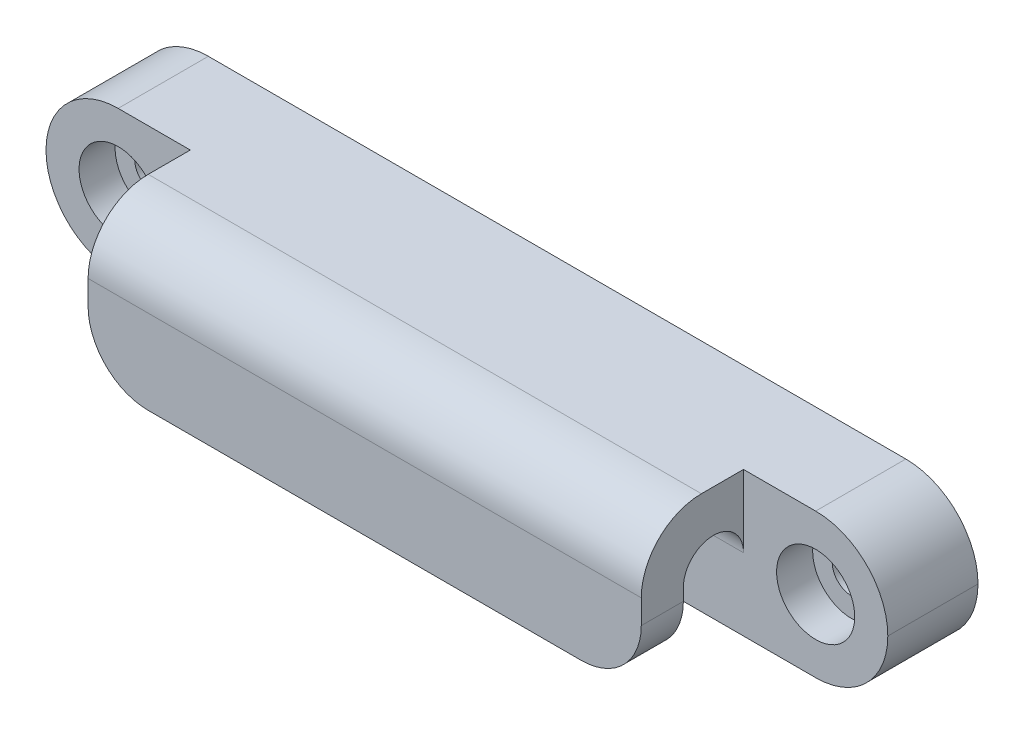
ISO-10303-21;
HEADER;
FILE_DESCRIPTION(('STEP AP214'),'2;1');
FILE_NAME('part.step','',(''),(''),'','','');
FILE_SCHEMA(('AUTOMOTIVE_DESIGN { 1 0 10303 214 1 1 1 1 }'));
ENDSEC;
DATA;
#1=APPLICATION_CONTEXT('core data for automotive mechanical design processes');
#2=APPLICATION_PROTOCOL_DEFINITION('international standard','automotive_design',2000,#1);
#3=PRODUCT_CONTEXT('',#1,'mechanical');
#4=PRODUCT('Part','Part','',(#3));
#5=PRODUCT_RELATED_PRODUCT_CATEGORY('part','',(#4));
#6=PRODUCT_DEFINITION_FORMATION('','',#4);
#7=PRODUCT_DEFINITION_CONTEXT('part definition',#1,'design');
#8=PRODUCT_DEFINITION('design','',#6,#7);
#9=PRODUCT_DEFINITION_SHAPE('','',#8);
#10=(LENGTH_UNIT() NAMED_UNIT(*) SI_UNIT(.MILLI.,.METRE.));
#11=(NAMED_UNIT(*) PLANE_ANGLE_UNIT() SI_UNIT($,.RADIAN.));
#12=(NAMED_UNIT(*) SI_UNIT($,.STERADIAN.) SOLID_ANGLE_UNIT());
#13=UNCERTAINTY_MEASURE_WITH_UNIT(LENGTH_MEASURE(1.E-05),#10,'distance_accuracy_value','');
#14=(GEOMETRIC_REPRESENTATION_CONTEXT(3) GLOBAL_UNCERTAINTY_ASSIGNED_CONTEXT((#13)) GLOBAL_UNIT_ASSIGNED_CONTEXT((#10,
#11,#12)) REPRESENTATION_CONTEXT('',''));
#15=CARTESIAN_POINT('',(0.,0.,0.));
#16=DIRECTION('',(0.,0.,1.));
#17=DIRECTION('',(1.,0.,0.));
#18=AXIS2_PLACEMENT_3D('',#15,#16,#17);
#19=CARTESIAN_POINT('',(-29.,0.,0.));
#20=DIRECTION('',(0.,0.,1.));
#21=DIRECTION('',(1.,0.,0.));
#22=AXIS2_PLACEMENT_3D('',#19,#20,#21);
#23=CYLINDRICAL_SURFACE('',#22,1.625);
#24=CARTESIAN_POINT('',(-29.,0.,0.));
#25=DIRECTION('',(0.,0.,1.));
#26=DIRECTION('',(1.,0.,0.));
#27=AXIS2_PLACEMENT_3D('',#24,#25,#26);
#28=CIRCLE('',#27,1.625);
#29=CARTESIAN_POINT('',(-27.375,0.,0.));
#30=VERTEX_POINT('',#29);
#31=EDGE_CURVE('E180',#30,#30,#28,.T.);
#32=ORIENTED_EDGE('',*,*,#31,.F.);
#33=EDGE_LOOP('',(#32));
#34=FACE_BOUND('',#33,.T.);
#35=CARTESIAN_POINT('',(-29.,0.,4.5));
#36=DIRECTION('',(0.,0.,1.));
#37=DIRECTION('',(1.,0.,0.));
#38=AXIS2_PLACEMENT_3D('',#35,#36,#37);
#39=CIRCLE('',#38,1.625);
#40=CARTESIAN_POINT('',(-27.375,0.,4.5));
#41=VERTEX_POINT('',#40);
#42=EDGE_CURVE('E216',#41,#41,#39,.F.);
#43=ORIENTED_EDGE('',*,*,#42,.F.);
#44=EDGE_LOOP('',(#43));
#45=FACE_BOUND('',#44,.T.);
#46=ADVANCED_FACE('F33',(#34,#45),#23,.F.);
#47=CARTESIAN_POINT('',(-35.,-6.,16.));
#48=DIRECTION('',(0.,1.,0.));
#49=DIRECTION('',(0.,0.,1.));
#50=AXIS2_PLACEMENT_3D('',#47,#48,#49);
#51=PLANE('',#50);
#52=DIRECTION('',(1.,0.,0.));
#53=VECTOR('',#52,1.);
#54=CARTESIAN_POINT('',(-35.,-6.,0.));
#55=LINE('',#54,#53);
#56=CARTESIAN_POINT('',(-29.,-6.,0.));
#57=VERTEX_POINT('',#56);
#58=CARTESIAN_POINT('',(29.,-6.,0.));
#59=VERTEX_POINT('',#58);
#60=EDGE_CURVE('E205',#57,#59,#55,.T.);
#61=ORIENTED_EDGE('',*,*,#60,.T.);
#62=DIRECTION('',(0.,0.,-1.));
#63=VECTOR('',#62,1.);
#64=CARTESIAN_POINT('',(29.,-6.,16.));
#65=LINE('',#64,#63);
#66=CARTESIAN_POINT('',(29.,-6.,7.5));
#67=VERTEX_POINT('',#66);
#68=EDGE_CURVE('E246',#59,#67,#65,.F.);
#69=ORIENTED_EDGE('',*,*,#68,.T.);
#70=DIRECTION('',(-1.,0.,0.));
#71=VECTOR('',#70,1.);
#72=CARTESIAN_POINT('',(-35.,-6.,7.5));
#73=LINE('',#72,#71);
#74=CARTESIAN_POINT('',(-29.,-6.,7.5));
#75=VERTEX_POINT('',#74);
#76=EDGE_CURVE('E197',#67,#75,#73,.T.);
#77=ORIENTED_EDGE('',*,*,#76,.T.);
#78=DIRECTION('',(0.,0.,-1.));
#79=VECTOR('',#78,1.);
#80=CARTESIAN_POINT('',(-29.,-6.,16.));
#81=LINE('',#80,#79);
#82=EDGE_CURVE('E244',#75,#57,#81,.T.);
#83=ORIENTED_EDGE('',*,*,#82,.T.);
#84=EDGE_LOOP('',(#61,#69,#77,#83));
#85=FACE_BOUND('',#84,.T.);
#86=ADVANCED_FACE('F306',(#85),#51,.F.);
#87=CARTESIAN_POINT('',(-35.,6.,16.));
#88=DIRECTION('',(0.,-1.,0.));
#89=DIRECTION('',(0.,0.,-1.));
#90=AXIS2_PLACEMENT_3D('',#87,#88,#89);
#91=PLANE('',#90);
#92=DIRECTION('',(-1.,0.,0.));
#93=VECTOR('',#92,1.);
#94=CARTESIAN_POINT('',(35.,6.,7.5));
#95=LINE('',#94,#93);
#96=CARTESIAN_POINT('',(29.,6.,7.5));
#97=VERTEX_POINT('',#96);
#98=CARTESIAN_POINT('',(23.,6.,7.5));
#99=VERTEX_POINT('',#98);
#100=EDGE_CURVE('E174',#97,#99,#95,.T.);
#101=ORIENTED_EDGE('',*,*,#100,.F.);
#102=DIRECTION('',(0.,0.,-1.));
#103=VECTOR('',#102,1.);
#104=CARTESIAN_POINT('',(29.,6.,16.));
#105=LINE('',#104,#103);
#106=CARTESIAN_POINT('',(29.,6.,0.));
#107=VERTEX_POINT('',#106);
#108=EDGE_CURVE('E225',#97,#107,#105,.T.);
#109=ORIENTED_EDGE('',*,*,#108,.T.);
#110=DIRECTION('',(-1.,0.,0.));
#111=VECTOR('',#110,1.);
#112=CARTESIAN_POINT('',(-35.,6.,0.));
#113=LINE('',#112,#111);
#114=CARTESIAN_POINT('',(-29.,6.,0.));
#115=VERTEX_POINT('',#114);
#116=EDGE_CURVE('E200',#107,#115,#113,.T.);
#117=ORIENTED_EDGE('',*,*,#116,.T.);
#118=DIRECTION('',(0.,0.,-1.));
#119=VECTOR('',#118,1.);
#120=CARTESIAN_POINT('',(-29.,6.,16.));
#121=LINE('',#120,#119);
#122=CARTESIAN_POINT('',(-29.,6.,7.5));
#123=VERTEX_POINT('',#122);
#124=EDGE_CURVE('E168',#115,#123,#121,.F.);
#125=ORIENTED_EDGE('',*,*,#124,.T.);
#126=DIRECTION('',(-1.,0.,0.));
#127=VECTOR('',#126,1.);
#128=CARTESIAN_POINT('',(-35.,6.,7.5));
#129=LINE('',#128,#127);
#130=CARTESIAN_POINT('',(-23.,6.,7.5));
#131=VERTEX_POINT('',#130);
#132=EDGE_CURVE('E144',#131,#123,#129,.T.);
#133=ORIENTED_EDGE('',*,*,#132,.F.);
#134=DIRECTION('',(0.,0.,1.));
#135=VECTOR('',#134,1.);
#136=CARTESIAN_POINT('',(-23.,6.,7.5));
#137=LINE('',#136,#135);
#138=CARTESIAN_POINT('',(-23.,6.,11.));
#139=VERTEX_POINT('',#138);
#140=EDGE_CURVE('E154',#131,#139,#137,.T.);
#141=ORIENTED_EDGE('',*,*,#140,.T.);
#142=DIRECTION('',(-1.,0.,0.));
#143=VECTOR('',#142,1.);
#144=CARTESIAN_POINT('',(23.,6.,11.));
#145=LINE('',#144,#143);
#146=CARTESIAN_POINT('',(23.,6.,11.));
#147=VERTEX_POINT('',#146);
#148=EDGE_CURVE('E212',#139,#147,#145,.F.);
#149=ORIENTED_EDGE('',*,*,#148,.T.);
#150=DIRECTION('',(0.,0.,1.));
#151=VECTOR('',#150,1.);
#152=CARTESIAN_POINT('',(23.,6.,7.5));
#153=LINE('',#152,#151);
#154=EDGE_CURVE('E172',#99,#147,#153,.T.);
#155=ORIENTED_EDGE('',*,*,#154,.F.);
#156=EDGE_LOOP('',(#101,#109,#117,#125,#133,#141,#149,#155));
#157=FACE_BOUND('',#156,.T.);
#158=ADVANCED_FACE('F165',(#157),#91,.F.);
#159=DIRECTION('',(1.,0.,0.));
#160=VECTOR('',#159,1.);
#161=CARTESIAN_POINT('',(-35.,-6.,16.));
#162=LINE('',#161,#160);
#163=CARTESIAN_POINT('',(-18.,-6.,16.));
#164=VERTEX_POINT('',#163);
#165=CARTESIAN_POINT('',(18.,-6.,16.));
#166=VERTEX_POINT('',#165);
#167=EDGE_CURVE('E201',#164,#166,#162,.T.);
#168=ORIENTED_EDGE('',*,*,#167,.F.);
#169=DIRECTION('',(0.,0.,1.));
#170=VECTOR('',#169,1.);
#171=CARTESIAN_POINT('',(-18.,-6.,16.));
#172=LINE('',#171,#170);
#173=CARTESIAN_POINT('',(-18.,-6.,12.5));
#174=VERTEX_POINT('',#173);
#175=EDGE_CURVE('E265',#164,#174,#172,.F.);
#176=ORIENTED_EDGE('',*,*,#175,.T.);
#177=DIRECTION('',(1.,0.,0.));
#178=VECTOR('',#177,1.);
#179=CARTESIAN_POINT('',(-35.,-6.,12.5));
#180=LINE('',#179,#178);
#181=CARTESIAN_POINT('',(18.,-6.,12.5));
#182=VERTEX_POINT('',#181);
#183=EDGE_CURVE('E193',#174,#182,#180,.T.);
#184=ORIENTED_EDGE('',*,*,#183,.T.);
#185=DIRECTION('',(0.,0.,1.));
#186=VECTOR('',#185,1.);
#187=CARTESIAN_POINT('',(18.,-6.,16.));
#188=LINE('',#187,#186);
#189=EDGE_CURVE('E262',#182,#166,#188,.T.);
#190=ORIENTED_EDGE('',*,*,#189,.T.);
#191=EDGE_LOOP('',(#168,#176,#184,#190));
#192=FACE_BOUND('',#191,.T.);
#193=ADVANCED_FACE('F279',(#192),#51,.F.);
#194=CARTESIAN_POINT('',(0.,0.,16.));
#195=DIRECTION('',(0.,0.,1.));
#196=DIRECTION('',(1.,0.,0.));
#197=AXIS2_PLACEMENT_3D('',#194,#195,#196);
#198=PLANE('',#197);
#199=DIRECTION('',(0.,1.,0.));
#200=VECTOR('',#199,1.);
#201=CARTESIAN_POINT('',(-23.,6.,16.));
#202=LINE('',#201,#200);
#203=CARTESIAN_POINT('',(-23.,-1.,16.));
#204=VERTEX_POINT('',#203);
#205=CARTESIAN_POINT('',(-23.,0.999999999999999,16.));
#206=VERTEX_POINT('',#205);
#207=EDGE_CURVE('E151',#204,#206,#202,.T.);
#208=ORIENTED_EDGE('',*,*,#207,.F.);
#209=CARTESIAN_POINT('',(-18.,-1.,16.));
#210=DIRECTION('',(0.,0.,1.));
#211=DIRECTION('',(1.,0.,0.));
#212=AXIS2_PLACEMENT_3D('',#209,#210,#211);
#213=CIRCLE('',#212,5.);
#214=EDGE_CURVE('E260',#204,#164,#213,.T.);
#215=ORIENTED_EDGE('',*,*,#214,.T.);
#216=ORIENTED_EDGE('',*,*,#167,.T.);
#217=CARTESIAN_POINT('',(18.,-1.,16.));
#218=DIRECTION('',(0.,0.,1.));
#219=DIRECTION('',(1.,0.,0.));
#220=AXIS2_PLACEMENT_3D('',#217,#218,#219);
#221=CIRCLE('',#220,5.);
#222=CARTESIAN_POINT('',(23.,-1.,16.));
#223=VERTEX_POINT('',#222);
#224=EDGE_CURVE('E258',#166,#223,#221,.T.);
#225=ORIENTED_EDGE('',*,*,#224,.T.);
#226=DIRECTION('',(0.,-1.,0.));
#227=VECTOR('',#226,1.);
#228=CARTESIAN_POINT('',(23.,6.,16.));
#229=LINE('',#228,#227);
#230=CARTESIAN_POINT('',(23.,0.999999999999999,16.));
#231=VERTEX_POINT('',#230);
#232=EDGE_CURVE('E177',#231,#223,#229,.T.);
#233=ORIENTED_EDGE('',*,*,#232,.F.);
#234=DIRECTION('',(-1.,0.,0.));
#235=VECTOR('',#234,1.);
#236=CARTESIAN_POINT('',(-23.,0.999999999999999,16.));
#237=LINE('',#236,#235);
#238=EDGE_CURVE('E204',#231,#206,#237,.T.);
#239=ORIENTED_EDGE('',*,*,#238,.T.);
#240=EDGE_LOOP('',(#208,#215,#216,#225,#233,#239));
#241=FACE_BOUND('',#240,.T.);
#242=ADVANCED_FACE('F277',(#241),#198,.T.);
#243=CARTESIAN_POINT('',(0.,0.,0.));
#244=DIRECTION('',(0.,0.,1.));
#245=DIRECTION('',(1.,0.,0.));
#246=AXIS2_PLACEMENT_3D('',#243,#244,#245);
#247=PLANE('',#246);
#248=ORIENTED_EDGE('',*,*,#31,.T.);
#249=EDGE_LOOP('',(#248));
#250=FACE_BOUND('',#249,.T.);
#251=CARTESIAN_POINT('',(29.,0.,0.));
#252=DIRECTION('',(0.,0.,1.));
#253=DIRECTION('',(-1.,0.,0.));
#254=AXIS2_PLACEMENT_3D('',#251,#252,#253);
#255=CIRCLE('',#254,1.625);
#256=CARTESIAN_POINT('',(27.375,0.,0.));
#257=VERTEX_POINT('',#256);
#258=EDGE_CURVE('E223',#257,#257,#255,.T.);
#259=ORIENTED_EDGE('',*,*,#258,.T.);
#260=EDGE_LOOP('',(#259));
#261=FACE_BOUND('',#260,.T.);
#262=ORIENTED_EDGE('',*,*,#116,.F.);
#263=CARTESIAN_POINT('',(29.,0.,0.));
#264=DIRECTION('',(0.,0.,1.));
#265=DIRECTION('',(1.,0.,0.));
#266=AXIS2_PLACEMENT_3D('',#263,#264,#265);
#267=CIRCLE('',#266,6.);
#268=CARTESIAN_POINT('',(35.,0.,0.));
#269=VERTEX_POINT('',#268);
#270=EDGE_CURVE('E234',#107,#269,#267,.F.);
#271=ORIENTED_EDGE('',*,*,#270,.T.);
#272=CARTESIAN_POINT('',(29.,0.,0.));
#273=DIRECTION('',(0.,0.,1.));
#274=DIRECTION('',(1.,0.,0.));
#275=AXIS2_PLACEMENT_3D('',#272,#273,#274);
#276=CIRCLE('',#275,6.);
#277=EDGE_CURVE('E232',#269,#59,#276,.F.);
#278=ORIENTED_EDGE('',*,*,#277,.T.);
#279=ORIENTED_EDGE('',*,*,#60,.F.);
#280=CARTESIAN_POINT('',(-29.,0.,0.));
#281=DIRECTION('',(0.,0.,1.));
#282=DIRECTION('',(1.,0.,0.));
#283=AXIS2_PLACEMENT_3D('',#280,#281,#282);
#284=CIRCLE('',#283,6.);
#285=CARTESIAN_POINT('',(-35.,0.,0.));
#286=VERTEX_POINT('',#285);
#287=EDGE_CURVE('E228',#57,#286,#284,.F.);
#288=ORIENTED_EDGE('',*,*,#287,.T.);
#289=CARTESIAN_POINT('',(-29.,0.,0.));
#290=DIRECTION('',(0.,0.,1.));
#291=DIRECTION('',(1.,0.,0.));
#292=AXIS2_PLACEMENT_3D('',#289,#290,#291);
#293=CIRCLE('',#292,6.);
#294=EDGE_CURVE('E230',#286,#115,#293,.F.);
#295=ORIENTED_EDGE('',*,*,#294,.T.);
#296=EDGE_LOOP('',(#262,#271,#278,#279,#288,#295));
#297=FACE_BOUND('',#296,.T.);
#298=ADVANCED_FACE('F298',(#250,#261,#297),#247,.F.);
#299=CARTESIAN_POINT('',(35.,0.,10.));
#300=DIRECTION('',(-1.,0.,0.));
#301=DIRECTION('',(0.,0.,1.));
#302=AXIS2_PLACEMENT_3D('',#299,#300,#301);
#303=CYLINDRICAL_SURFACE('',#302,2.5);
#304=DIRECTION('',(-1.,0.,0.));
#305=VECTOR('',#304,1.);
#306=CARTESIAN_POINT('',(35.,0.,12.5));
#307=LINE('',#306,#305);
#308=CARTESIAN_POINT('',(23.,0.,12.5));
#309=VERTEX_POINT('',#308);
#310=CARTESIAN_POINT('',(-23.,0.,12.5));
#311=VERTEX_POINT('',#310);
#312=EDGE_CURVE('E191',#309,#311,#307,.T.);
#313=ORIENTED_EDGE('',*,*,#312,.T.);
#314=CARTESIAN_POINT('',(-23.,0.,10.));
#315=DIRECTION('',(1.,0.,0.));
#316=DIRECTION('',(0.,1.,0.));
#317=AXIS2_PLACEMENT_3D('',#314,#315,#316);
#318=CIRCLE('',#317,2.5);
#319=CARTESIAN_POINT('',(-23.,0.,7.5));
#320=VERTEX_POINT('',#319);
#321=EDGE_CURVE('E189',#311,#320,#318,.F.);
#322=ORIENTED_EDGE('',*,*,#321,.T.);
#323=DIRECTION('',(-1.,0.,0.));
#324=VECTOR('',#323,1.);
#325=CARTESIAN_POINT('',(35.,0.,7.5));
#326=LINE('',#325,#324);
#327=CARTESIAN_POINT('',(23.,0.,7.5));
#328=VERTEX_POINT('',#327);
#329=EDGE_CURVE('E147',#328,#320,#326,.T.);
#330=ORIENTED_EDGE('',*,*,#329,.F.);
#331=CARTESIAN_POINT('',(23.,0.,10.));
#332=DIRECTION('',(-1.,0.,0.));
#333=DIRECTION('',(0.,-1.,0.));
#334=AXIS2_PLACEMENT_3D('',#331,#332,#333);
#335=CIRCLE('',#334,2.5);
#336=EDGE_CURVE('E184',#328,#309,#335,.F.);
#337=ORIENTED_EDGE('',*,*,#336,.T.);
#338=EDGE_LOOP('',(#313,#322,#330,#337));
#339=FACE_BOUND('',#338,.T.);
#340=ADVANCED_FACE('F348',(#339),#303,.F.);
#341=CARTESIAN_POINT('',(35.,0.,12.5));
#342=DIRECTION('',(0.,0.,1.));
#343=DIRECTION('',(1.,0.,0.));
#344=AXIS2_PLACEMENT_3D('',#341,#342,#343);
#345=PLANE('',#344);
#346=ORIENTED_EDGE('',*,*,#183,.F.);
#347=CARTESIAN_POINT('',(-18.,-1.,12.5));
#348=DIRECTION('',(0.,0.,1.));
#349=DIRECTION('',(1.,0.,0.));
#350=AXIS2_PLACEMENT_3D('',#347,#348,#349);
#351=CIRCLE('',#350,5.);
#352=CARTESIAN_POINT('',(-23.,-1.,12.5));
#353=VERTEX_POINT('',#352);
#354=EDGE_CURVE('E41',#174,#353,#351,.F.);
#355=ORIENTED_EDGE('',*,*,#354,.T.);
#356=DIRECTION('',(0.,1.,0.));
#357=VECTOR('',#356,1.);
#358=CARTESIAN_POINT('',(-23.,0.,12.5));
#359=LINE('',#358,#357);
#360=EDGE_CURVE('E187',#353,#311,#359,.T.);
#361=ORIENTED_EDGE('',*,*,#360,.T.);
#362=ORIENTED_EDGE('',*,*,#312,.F.);
#363=DIRECTION('',(0.,-1.,0.));
#364=VECTOR('',#363,1.);
#365=CARTESIAN_POINT('',(23.,0.,12.5));
#366=LINE('',#365,#364);
#367=CARTESIAN_POINT('',(23.,-1.,12.5));
#368=VERTEX_POINT('',#367);
#369=EDGE_CURVE('E161',#309,#368,#366,.T.);
#370=ORIENTED_EDGE('',*,*,#369,.T.);
#371=CARTESIAN_POINT('',(18.,-1.,12.5));
#372=DIRECTION('',(0.,0.,1.));
#373=DIRECTION('',(1.,0.,0.));
#374=AXIS2_PLACEMENT_3D('',#371,#372,#373);
#375=CIRCLE('',#374,5.);
#376=EDGE_CURVE('E53',#368,#182,#375,.F.);
#377=ORIENTED_EDGE('',*,*,#376,.T.);
#378=EDGE_LOOP('',(#346,#355,#361,#362,#370,#377));
#379=FACE_BOUND('',#378,.T.);
#380=ADVANCED_FACE('F268',(#379),#345,.F.);
#381=CARTESIAN_POINT('',(35.,-7.66189890097054,7.5));
#382=DIRECTION('',(0.,0.,-1.));
#383=DIRECTION('',(-1.,0.,0.));
#384=AXIS2_PLACEMENT_3D('',#381,#382,#383);
#385=PLANE('',#384);
#386=CARTESIAN_POINT('',(-29.,0.,7.5));
#387=DIRECTION('',(0.,0.,1.));
#388=DIRECTION('',(1.,0.,0.));
#389=AXIS2_PLACEMENT_3D('',#386,#387,#388);
#390=CIRCLE('',#389,3.25);
#391=CARTESIAN_POINT('',(-25.75,0.,7.5));
#392=VERTEX_POINT('',#391);
#393=EDGE_CURVE('E385',#392,#392,#390,.T.);
#394=ORIENTED_EDGE('',*,*,#393,.F.);
#395=EDGE_LOOP('',(#394));
#396=FACE_BOUND('',#395,.T.);
#397=CARTESIAN_POINT('',(29.,0.,7.5));
#398=DIRECTION('',(0.,0.,1.));
#399=DIRECTION('',(-1.,0.,0.));
#400=AXIS2_PLACEMENT_3D('',#397,#398,#399);
#401=CIRCLE('',#400,3.25);
#402=CARTESIAN_POINT('',(25.75,0.,7.5));
#403=VERTEX_POINT('',#402);
#404=EDGE_CURVE('E252',#403,#403,#401,.T.);
#405=ORIENTED_EDGE('',*,*,#404,.F.);
#406=EDGE_LOOP('',(#405));
#407=FACE_BOUND('',#406,.T.);
#408=CARTESIAN_POINT('',(29.,0.,7.5));
#409=DIRECTION('',(0.,0.,-1.));
#410=DIRECTION('',(-1.,0.,0.));
#411=AXIS2_PLACEMENT_3D('',#408,#409,#410);
#412=CIRCLE('',#411,6.);
#413=CARTESIAN_POINT('',(35.,0.,7.5));
#414=VERTEX_POINT('',#413);
#415=EDGE_CURVE('E240',#67,#414,#412,.F.);
#416=ORIENTED_EDGE('',*,*,#415,.T.);
#417=CARTESIAN_POINT('',(29.,0.,7.5));
#418=DIRECTION('',(0.,0.,-1.));
#419=DIRECTION('',(-1.,0.,0.));
#420=AXIS2_PLACEMENT_3D('',#417,#418,#419);
#421=CIRCLE('',#420,6.);
#422=EDGE_CURVE('E242',#414,#97,#421,.F.);
#423=ORIENTED_EDGE('',*,*,#422,.T.);
#424=ORIENTED_EDGE('',*,*,#100,.T.);
#425=DIRECTION('',(0.,-1.,0.));
#426=VECTOR('',#425,1.);
#427=CARTESIAN_POINT('',(23.,6.,7.5));
#428=LINE('',#427,#426);
#429=EDGE_CURVE('E176',#99,#328,#428,.T.);
#430=ORIENTED_EDGE('',*,*,#429,.T.);
#431=ORIENTED_EDGE('',*,*,#329,.T.);
#432=DIRECTION('',(0.,1.,0.));
#433=VECTOR('',#432,1.);
#434=CARTESIAN_POINT('',(-23.,6.,7.5));
#435=LINE('',#434,#433);
#436=EDGE_CURVE('E140',#320,#131,#435,.T.);
#437=ORIENTED_EDGE('',*,*,#436,.T.);
#438=ORIENTED_EDGE('',*,*,#132,.T.);
#439=CARTESIAN_POINT('',(-29.,0.,7.5));
#440=DIRECTION('',(0.,0.,-1.));
#441=DIRECTION('',(-1.,0.,0.));
#442=AXIS2_PLACEMENT_3D('',#439,#440,#441);
#443=CIRCLE('',#442,6.);
#444=CARTESIAN_POINT('',(-35.,0.,7.5));
#445=VERTEX_POINT('',#444);
#446=EDGE_CURVE('E238',#123,#445,#443,.F.);
#447=ORIENTED_EDGE('',*,*,#446,.T.);
#448=CARTESIAN_POINT('',(-29.,0.,7.5));
#449=DIRECTION('',(0.,0.,-1.));
#450=DIRECTION('',(-1.,0.,0.));
#451=AXIS2_PLACEMENT_3D('',#448,#449,#450);
#452=CIRCLE('',#451,6.);
#453=EDGE_CURVE('E236',#445,#75,#452,.F.);
#454=ORIENTED_EDGE('',*,*,#453,.T.);
#455=ORIENTED_EDGE('',*,*,#76,.F.);
#456=EDGE_LOOP('',(#416,#423,#424,#430,#431,#437,#438,#447,#454,#455));
#457=FACE_BOUND('',#456,.T.);
#458=ADVANCED_FACE('F142',(#396,#407,#457),#385,.F.);
#459=CARTESIAN_POINT('',(23.,6.,7.5));
#460=DIRECTION('',(-1.,0.,0.));
#461=DIRECTION('',(0.,-1.,0.));
#462=AXIS2_PLACEMENT_3D('',#459,#460,#461);
#463=PLANE('',#462);
#464=ORIENTED_EDGE('',*,*,#232,.T.);
#465=DIRECTION('',(0.,0.,1.));
#466=VECTOR('',#465,1.);
#467=CARTESIAN_POINT('',(23.,-1.,7.5));
#468=LINE('',#467,#466);
#469=EDGE_CURVE('E11',#223,#368,#468,.F.);
#470=ORIENTED_EDGE('',*,*,#469,.T.);
#471=ORIENTED_EDGE('',*,*,#369,.F.);
#472=ORIENTED_EDGE('',*,*,#336,.F.);
#473=ORIENTED_EDGE('',*,*,#429,.F.);
#474=ORIENTED_EDGE('',*,*,#154,.T.);
#475=CARTESIAN_POINT('',(23.,0.999999999999999,11.));
#476=DIRECTION('',(-1.,0.,0.));
#477=DIRECTION('',(0.,-1.,0.));
#478=AXIS2_PLACEMENT_3D('',#475,#476,#477);
#479=CIRCLE('',#478,5.);
#480=EDGE_CURVE('E214',#147,#231,#479,.F.);
#481=ORIENTED_EDGE('',*,*,#480,.T.);
#482=EDGE_LOOP('',(#464,#470,#471,#472,#473,#474,#481));
#483=FACE_BOUND('',#482,.T.);
#484=ADVANCED_FACE('F284',(#483),#463,.F.);
#485=CARTESIAN_POINT('',(-23.,6.,7.5));
#486=DIRECTION('',(1.,0.,0.));
#487=DIRECTION('',(0.,1.,0.));
#488=AXIS2_PLACEMENT_3D('',#485,#486,#487);
#489=PLANE('',#488);
#490=ORIENTED_EDGE('',*,*,#360,.F.);
#491=DIRECTION('',(0.,0.,1.));
#492=VECTOR('',#491,1.);
#493=CARTESIAN_POINT('',(-23.,-1.,7.5));
#494=LINE('',#493,#492);
#495=EDGE_CURVE('E248',#353,#204,#494,.T.);
#496=ORIENTED_EDGE('',*,*,#495,.T.);
#497=ORIENTED_EDGE('',*,*,#207,.T.);
#498=CARTESIAN_POINT('',(-23.,0.999999999999999,11.));
#499=DIRECTION('',(1.,0.,0.));
#500=DIRECTION('',(0.,1.,0.));
#501=AXIS2_PLACEMENT_3D('',#498,#499,#500);
#502=CIRCLE('',#501,5.);
#503=EDGE_CURVE('E158',#206,#139,#502,.F.);
#504=ORIENTED_EDGE('',*,*,#503,.T.);
#505=ORIENTED_EDGE('',*,*,#140,.F.);
#506=ORIENTED_EDGE('',*,*,#436,.F.);
#507=ORIENTED_EDGE('',*,*,#321,.F.);
#508=EDGE_LOOP('',(#490,#496,#497,#504,#505,#506,#507));
#509=FACE_BOUND('',#508,.T.);
#510=ADVANCED_FACE('F156',(#509),#489,.F.);
#511=CARTESIAN_POINT('',(0.,0.999999999999999,11.));
#512=DIRECTION('',(1.,0.,0.));
#513=DIRECTION('',(0.,0.,-1.));
#514=AXIS2_PLACEMENT_3D('',#511,#512,#513);
#515=CYLINDRICAL_SURFACE('',#514,5.);
#516=ORIENTED_EDGE('',*,*,#480,.F.);
#517=ORIENTED_EDGE('',*,*,#148,.F.);
#518=ORIENTED_EDGE('',*,*,#503,.F.);
#519=ORIENTED_EDGE('',*,*,#238,.F.);
#520=EDGE_LOOP('',(#516,#517,#518,#519));
#521=FACE_BOUND('',#520,.T.);
#522=ADVANCED_FACE('F289',(#521),#515,.T.);
#523=CARTESIAN_POINT('',(29.,0.,0.));
#524=DIRECTION('',(0.,0.,1.));
#525=DIRECTION('',(1.,0.,0.));
#526=AXIS2_PLACEMENT_3D('',#523,#524,#525);
#527=CYLINDRICAL_SURFACE('',#526,1.625);
#528=CARTESIAN_POINT('',(29.,0.,4.5));
#529=DIRECTION('',(0.,0.,-1.));
#530=DIRECTION('',(-1.,0.,0.));
#531=AXIS2_PLACEMENT_3D('',#528,#529,#530);
#532=CIRCLE('',#531,1.625);
#533=CARTESIAN_POINT('',(27.375,0.,4.5));
#534=VERTEX_POINT('',#533);
#535=EDGE_CURVE('E219',#534,#534,#532,.F.);
#536=ORIENTED_EDGE('',*,*,#535,.T.);
#537=EDGE_LOOP('',(#536));
#538=FACE_BOUND('',#537,.T.);
#539=ORIENTED_EDGE('',*,*,#258,.F.);
#540=EDGE_LOOP('',(#539));
#541=FACE_BOUND('',#540,.T.);
#542=ADVANCED_FACE('F337',(#538,#541),#527,.F.);
#543=CARTESIAN_POINT('',(-29.,0.,4.5));
#544=DIRECTION('',(0.,0.,1.));
#545=DIRECTION('',(1.,0.,0.));
#546=AXIS2_PLACEMENT_3D('',#543,#544,#545);
#547=PLANE('',#546);
#548=CARTESIAN_POINT('',(-29.,0.,4.5));
#549=DIRECTION('',(0.,0.,1.));
#550=DIRECTION('',(1.,0.,0.));
#551=AXIS2_PLACEMENT_3D('',#548,#549,#550);
#552=CIRCLE('',#551,3.25);
#553=CARTESIAN_POINT('',(-25.75,0.,4.5));
#554=VERTEX_POINT('',#553);
#555=EDGE_CURVE('E220',#554,#554,#552,.T.);
#556=ORIENTED_EDGE('',*,*,#555,.T.);
#557=EDGE_LOOP('',(#556));
#558=FACE_BOUND('',#557,.T.);
#559=ORIENTED_EDGE('',*,*,#42,.T.);
#560=EDGE_LOOP('',(#559));
#561=FACE_BOUND('',#560,.T.);
#562=ADVANCED_FACE('F340',(#558,#561),#547,.T.);
#563=CARTESIAN_POINT('',(-29.,0.,4.5));
#564=DIRECTION('',(0.,0.,1.));
#565=DIRECTION('',(1.,0.,0.));
#566=AXIS2_PLACEMENT_3D('',#563,#564,#565);
#567=CYLINDRICAL_SURFACE('',#566,3.25);
#568=ORIENTED_EDGE('',*,*,#555,.F.);
#569=EDGE_LOOP('',(#568));
#570=FACE_BOUND('',#569,.T.);
#571=ORIENTED_EDGE('',*,*,#393,.T.);
#572=EDGE_LOOP('',(#571));
#573=FACE_BOUND('',#572,.T.);
#574=ADVANCED_FACE('F375',(#570,#573),#567,.F.);
#575=CARTESIAN_POINT('',(29.,0.,4.5));
#576=DIRECTION('',(0.,0.,-1.));
#577=DIRECTION('',(-1.,0.,0.));
#578=AXIS2_PLACEMENT_3D('',#575,#576,#577);
#579=PLANE('',#578);
#580=CARTESIAN_POINT('',(29.,0.,4.5));
#581=DIRECTION('',(0.,0.,1.));
#582=DIRECTION('',(-1.,0.,0.));
#583=AXIS2_PLACEMENT_3D('',#580,#581,#582);
#584=CIRCLE('',#583,3.25);
#585=CARTESIAN_POINT('',(25.75,0.,4.5));
#586=VERTEX_POINT('',#585);
#587=EDGE_CURVE('E380',#586,#586,#584,.T.);
#588=ORIENTED_EDGE('',*,*,#587,.T.);
#589=EDGE_LOOP('',(#588));
#590=FACE_BOUND('',#589,.T.);
#591=ORIENTED_EDGE('',*,*,#535,.F.);
#592=EDGE_LOOP('',(#591));
#593=FACE_BOUND('',#592,.T.);
#594=ADVANCED_FACE('F370',(#590,#593),#579,.F.);
#595=CARTESIAN_POINT('',(29.,0.,4.5));
#596=DIRECTION('',(0.,0.,1.));
#597=DIRECTION('',(1.,0.,0.));
#598=AXIS2_PLACEMENT_3D('',#595,#596,#597);
#599=CYLINDRICAL_SURFACE('',#598,3.25);
#600=ORIENTED_EDGE('',*,*,#587,.F.);
#601=EDGE_LOOP('',(#600));
#602=FACE_BOUND('',#601,.T.);
#603=ORIENTED_EDGE('',*,*,#404,.T.);
#604=EDGE_LOOP('',(#603));
#605=FACE_BOUND('',#604,.T.);
#606=ADVANCED_FACE('F335',(#602,#605),#599,.F.);
#607=CARTESIAN_POINT('',(29.,0.,16.));
#608=DIRECTION('',(0.,0.,-1.));
#609=DIRECTION('',(-1.,0.,0.));
#610=AXIS2_PLACEMENT_3D('',#607,#608,#609);
#611=CYLINDRICAL_SURFACE('',#610,6.);
#612=DIRECTION('',(0.,0.,-1.));
#613=VECTOR('',#612,1.);
#614=CARTESIAN_POINT('',(35.,0.,16.));
#615=LINE('',#614,#613);
#616=EDGE_CURVE('E249',#414,#269,#615,.T.);
#617=ORIENTED_EDGE('',*,*,#616,.F.);
#618=ORIENTED_EDGE('',*,*,#415,.F.);
#619=ORIENTED_EDGE('',*,*,#68,.F.);
#620=ORIENTED_EDGE('',*,*,#277,.F.);
#621=EDGE_LOOP('',(#617,#618,#619,#620));
#622=FACE_BOUND('',#621,.T.);
#623=ADVANCED_FACE('F302',(#622),#611,.T.);
#624=CARTESIAN_POINT('',(29.,0.,16.));
#625=DIRECTION('',(0.,0.,-1.));
#626=DIRECTION('',(-1.,0.,0.));
#627=AXIS2_PLACEMENT_3D('',#624,#625,#626);
#628=CYLINDRICAL_SURFACE('',#627,6.);
#629=ORIENTED_EDGE('',*,*,#422,.F.);
#630=ORIENTED_EDGE('',*,*,#616,.T.);
#631=ORIENTED_EDGE('',*,*,#270,.F.);
#632=ORIENTED_EDGE('',*,*,#108,.F.);
#633=EDGE_LOOP('',(#629,#630,#631,#632));
#634=FACE_BOUND('',#633,.T.);
#635=ADVANCED_FACE('F294',(#634),#628,.T.);
#636=CARTESIAN_POINT('',(-29.,0.,16.));
#637=DIRECTION('',(0.,0.,-1.));
#638=DIRECTION('',(-1.,0.,0.));
#639=AXIS2_PLACEMENT_3D('',#636,#637,#638);
#640=CYLINDRICAL_SURFACE('',#639,6.);
#641=ORIENTED_EDGE('',*,*,#82,.F.);
#642=ORIENTED_EDGE('',*,*,#453,.F.);
#643=DIRECTION('',(0.,0.,-1.));
#644=VECTOR('',#643,1.);
#645=CARTESIAN_POINT('',(-35.,0.,16.));
#646=LINE('',#645,#644);
#647=EDGE_CURVE('E253',#286,#445,#646,.F.);
#648=ORIENTED_EDGE('',*,*,#647,.F.);
#649=ORIENTED_EDGE('',*,*,#287,.F.);
#650=EDGE_LOOP('',(#641,#642,#648,#649));
#651=FACE_BOUND('',#650,.T.);
#652=ADVANCED_FACE('F311',(#651),#640,.T.);
#653=CARTESIAN_POINT('',(-29.,0.,16.));
#654=DIRECTION('',(0.,0.,-1.));
#655=DIRECTION('',(-1.,0.,0.));
#656=AXIS2_PLACEMENT_3D('',#653,#654,#655);
#657=CYLINDRICAL_SURFACE('',#656,6.);
#658=ORIENTED_EDGE('',*,*,#446,.F.);
#659=ORIENTED_EDGE('',*,*,#124,.F.);
#660=ORIENTED_EDGE('',*,*,#294,.F.);
#661=ORIENTED_EDGE('',*,*,#647,.T.);
#662=EDGE_LOOP('',(#658,#659,#660,#661));
#663=FACE_BOUND('',#662,.T.);
#664=ADVANCED_FACE('F315',(#663),#657,.T.);
#665=CARTESIAN_POINT('',(-18.,-1.,7.5));
#666=DIRECTION('',(0.,0.,1.));
#667=DIRECTION('',(1.,0.,0.));
#668=AXIS2_PLACEMENT_3D('',#665,#666,#667);
#669=CYLINDRICAL_SURFACE('',#668,5.);
#670=ORIENTED_EDGE('',*,*,#354,.F.);
#671=ORIENTED_EDGE('',*,*,#175,.F.);
#672=ORIENTED_EDGE('',*,*,#214,.F.);
#673=ORIENTED_EDGE('',*,*,#495,.F.);
#674=EDGE_LOOP('',(#670,#671,#672,#673));
#675=FACE_BOUND('',#674,.T.);
#676=ADVANCED_FACE('F274',(#675),#669,.T.);
#677=CARTESIAN_POINT('',(18.,-1.,16.));
#678=DIRECTION('',(0.,0.,1.));
#679=DIRECTION('',(1.,0.,0.));
#680=AXIS2_PLACEMENT_3D('',#677,#678,#679);
#681=CYLINDRICAL_SURFACE('',#680,5.);
#682=ORIENTED_EDGE('',*,*,#376,.F.);
#683=ORIENTED_EDGE('',*,*,#469,.F.);
#684=ORIENTED_EDGE('',*,*,#224,.F.);
#685=ORIENTED_EDGE('',*,*,#189,.F.);
#686=EDGE_LOOP('',(#682,#683,#684,#685));
#687=FACE_BOUND('',#686,.T.);
#688=ADVANCED_FACE('F35',(#687),#681,.T.);
#689=CLOSED_SHELL('',(#46,#86,#158,#193,#242,#298,#340,#380,#458,#484,#510,#522,#542,#562,#574,
#594,#606,#623,#635,#652,#664,#676,#688));
#690=MANIFOLD_SOLID_BREP('B2',#689);
#691=ADVANCED_BREP_SHAPE_REPRESENTATION('',(#18,#690),#14);
#692=SHAPE_DEFINITION_REPRESENTATION(#9,#691);
ENDSEC;
END-ISO-10303-21;
